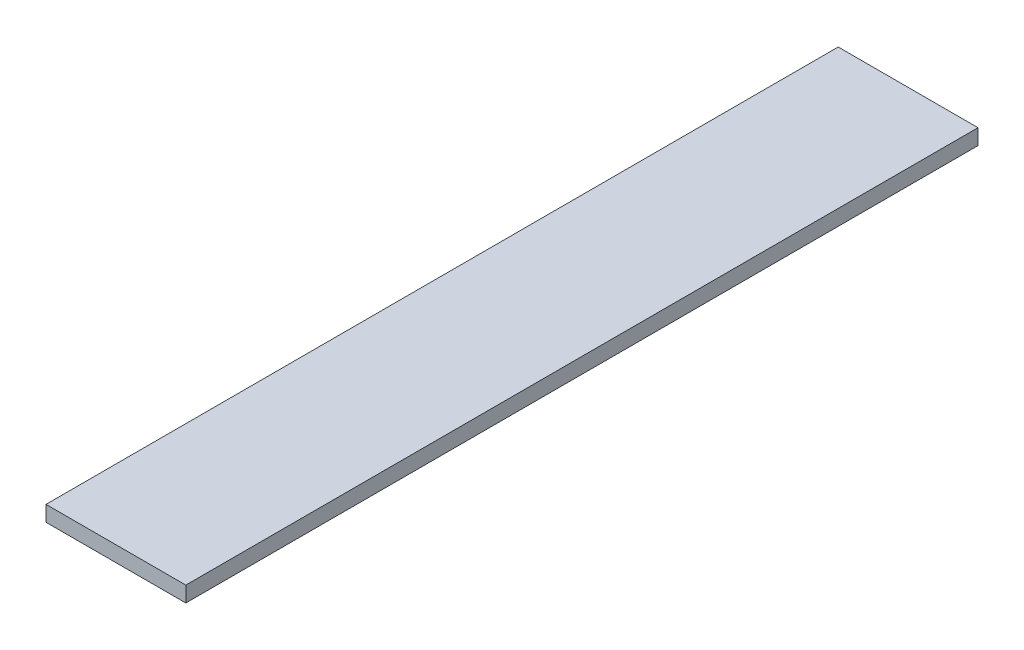
ISO-10303-21;
HEADER;
FILE_DESCRIPTION(('STEP AP214'),'2;1');
FILE_NAME('part.step','',(''),(''),'','','');
FILE_SCHEMA(('AUTOMOTIVE_DESIGN { 1 0 10303 214 1 1 1 1 }'));
ENDSEC;
DATA;
#1=APPLICATION_CONTEXT('core data for automotive mechanical design processes');
#2=APPLICATION_PROTOCOL_DEFINITION('international standard','automotive_design',2000,#1);
#3=PRODUCT_CONTEXT('',#1,'mechanical');
#4=PRODUCT('Part','Part','',(#3));
#5=PRODUCT_RELATED_PRODUCT_CATEGORY('part','',(#4));
#6=PRODUCT_DEFINITION_FORMATION('','',#4);
#7=PRODUCT_DEFINITION_CONTEXT('part definition',#1,'design');
#8=PRODUCT_DEFINITION('design','',#6,#7);
#9=PRODUCT_DEFINITION_SHAPE('','',#8);
#10=(LENGTH_UNIT() NAMED_UNIT(*) SI_UNIT(.MILLI.,.METRE.));
#11=(NAMED_UNIT(*) PLANE_ANGLE_UNIT() SI_UNIT($,.RADIAN.));
#12=(NAMED_UNIT(*) SI_UNIT($,.STERADIAN.) SOLID_ANGLE_UNIT());
#13=UNCERTAINTY_MEASURE_WITH_UNIT(LENGTH_MEASURE(1.E-05),#10,'distance_accuracy_value','');
#14=(GEOMETRIC_REPRESENTATION_CONTEXT(3) GLOBAL_UNCERTAINTY_ASSIGNED_CONTEXT((#13)) GLOBAL_UNIT_ASSIGNED_CONTEXT((#10,
#11,#12)) REPRESENTATION_CONTEXT('',''));
#15=CARTESIAN_POINT('',(0.,0.,0.));
#16=DIRECTION('',(0.,0.,1.));
#17=DIRECTION('',(1.,0.,0.));
#18=AXIS2_PLACEMENT_3D('',#15,#16,#17);
#19=CARTESIAN_POINT('',(57.15,12.7,-323.85));
#20=DIRECTION('',(-1.,0.,0.));
#21=DIRECTION('',(0.,0.,1.));
#22=AXIS2_PLACEMENT_3D('',#19,#20,#21);
#23=PLANE('',#22);
#24=DIRECTION('',(0.,0.,-1.));
#25=VECTOR('',#24,1.);
#26=CARTESIAN_POINT('',(57.15,0.,-323.85));
#27=LINE('',#26,#25);
#28=CARTESIAN_POINT('',(57.15,0.,323.85));
#29=VERTEX_POINT('',#28);
#30=CARTESIAN_POINT('',(57.15,0.,-323.85));
#31=VERTEX_POINT('',#30);
#32=EDGE_CURVE('E107',#29,#31,#27,.T.);
#33=ORIENTED_EDGE('',*,*,#32,.T.);
#34=DIRECTION('',(0.,-1.,0.));
#35=VECTOR('',#34,1.);
#36=CARTESIAN_POINT('',(57.15,12.7,-323.85));
#37=LINE('',#36,#35);
#38=CARTESIAN_POINT('',(57.15,12.7,-323.85));
#39=VERTEX_POINT('',#38);
#40=EDGE_CURVE('E11',#39,#31,#37,.T.);
#41=ORIENTED_EDGE('',*,*,#40,.F.);
#42=DIRECTION('',(0.,0.,-1.));
#43=VECTOR('',#42,1.);
#44=CARTESIAN_POINT('',(57.15,12.7,-323.85));
#45=LINE('',#44,#43);
#46=CARTESIAN_POINT('',(57.15,12.7,323.85));
#47=VERTEX_POINT('',#46);
#48=EDGE_CURVE('E91',#47,#39,#45,.T.);
#49=ORIENTED_EDGE('',*,*,#48,.F.);
#50=DIRECTION('',(0.,-1.,0.));
#51=VECTOR('',#50,1.);
#52=CARTESIAN_POINT('',(57.15,12.7,323.85));
#53=LINE('',#52,#51);
#54=EDGE_CURVE('E103',#47,#29,#53,.T.);
#55=ORIENTED_EDGE('',*,*,#54,.T.);
#56=EDGE_LOOP('',(#33,#41,#49,#55));
#57=FACE_BOUND('',#56,.T.);
#58=ADVANCED_FACE('F39',(#57),#23,.F.);
#59=CARTESIAN_POINT('',(-57.15,12.7,-323.85));
#60=DIRECTION('',(0.,0.,1.));
#61=DIRECTION('',(1.,0.,0.));
#62=AXIS2_PLACEMENT_3D('',#59,#60,#61);
#63=PLANE('',#62);
#64=DIRECTION('',(-1.,0.,0.));
#65=VECTOR('',#64,1.);
#66=CARTESIAN_POINT('',(-57.15,0.,-323.85));
#67=LINE('',#66,#65);
#68=CARTESIAN_POINT('',(-57.15,0.,-323.85));
#69=VERTEX_POINT('',#68);
#70=EDGE_CURVE('E96',#31,#69,#67,.T.);
#71=ORIENTED_EDGE('',*,*,#70,.T.);
#72=DIRECTION('',(0.,-1.,0.));
#73=VECTOR('',#72,1.);
#74=CARTESIAN_POINT('',(-57.15,12.7,-323.85));
#75=LINE('',#74,#73);
#76=CARTESIAN_POINT('',(-57.15,12.7,-323.85));
#77=VERTEX_POINT('',#76);
#78=EDGE_CURVE('E48',#77,#69,#75,.T.);
#79=ORIENTED_EDGE('',*,*,#78,.F.);
#80=DIRECTION('',(-1.,0.,0.));
#81=VECTOR('',#80,1.);
#82=CARTESIAN_POINT('',(-57.15,12.7,-323.85));
#83=LINE('',#82,#81);
#84=EDGE_CURVE('E86',#39,#77,#83,.T.);
#85=ORIENTED_EDGE('',*,*,#84,.F.);
#86=ORIENTED_EDGE('',*,*,#40,.T.);
#87=EDGE_LOOP('',(#71,#79,#85,#86));
#88=FACE_BOUND('',#87,.T.);
#89=ADVANCED_FACE('F95',(#88),#63,.F.);
#90=CARTESIAN_POINT('',(-57.15,12.7,-323.85));
#91=DIRECTION('',(1.,0.,0.));
#92=DIRECTION('',(0.,0.,-1.));
#93=AXIS2_PLACEMENT_3D('',#90,#91,#92);
#94=PLANE('',#93);
#95=DIRECTION('',(0.,0.,1.));
#96=VECTOR('',#95,1.);
#97=CARTESIAN_POINT('',(-57.15,0.,-323.85));
#98=LINE('',#97,#96);
#99=CARTESIAN_POINT('',(-57.1499999999999,0.,323.85));
#100=VERTEX_POINT('',#99);
#101=EDGE_CURVE('E73',#69,#100,#98,.T.);
#102=ORIENTED_EDGE('',*,*,#101,.T.);
#103=DIRECTION('',(0.,-1.,0.));
#104=VECTOR('',#103,1.);
#105=CARTESIAN_POINT('',(-57.1499999999999,12.7,323.85));
#106=LINE('',#105,#104);
#107=CARTESIAN_POINT('',(-57.1499999999999,12.7,323.85));
#108=VERTEX_POINT('',#107);
#109=EDGE_CURVE('E98',#108,#100,#106,.T.);
#110=ORIENTED_EDGE('',*,*,#109,.F.);
#111=DIRECTION('',(0.,0.,1.));
#112=VECTOR('',#111,1.);
#113=CARTESIAN_POINT('',(-57.15,12.7,-323.85));
#114=LINE('',#113,#112);
#115=EDGE_CURVE('E89',#77,#108,#114,.T.);
#116=ORIENTED_EDGE('',*,*,#115,.F.);
#117=ORIENTED_EDGE('',*,*,#78,.T.);
#118=EDGE_LOOP('',(#102,#110,#116,#117));
#119=FACE_BOUND('',#118,.T.);
#120=ADVANCED_FACE('F99',(#119),#94,.F.);
#121=CARTESIAN_POINT('',(-57.1499999999999,12.7,323.85));
#122=DIRECTION('',(0.,0.,-1.));
#123=DIRECTION('',(-1.,0.,0.));
#124=AXIS2_PLACEMENT_3D('',#121,#122,#123);
#125=PLANE('',#124);
#126=DIRECTION('',(1.,0.,0.));
#127=VECTOR('',#126,1.);
#128=CARTESIAN_POINT('',(-57.1499999999999,0.,323.85));
#129=LINE('',#128,#127);
#130=EDGE_CURVE('E79',#100,#29,#129,.T.);
#131=ORIENTED_EDGE('',*,*,#130,.T.);
#132=ORIENTED_EDGE('',*,*,#54,.F.);
#133=DIRECTION('',(1.,0.,0.));
#134=VECTOR('',#133,1.);
#135=CARTESIAN_POINT('',(-57.1499999999999,12.7,323.85));
#136=LINE('',#135,#134);
#137=EDGE_CURVE('E56',#108,#47,#136,.T.);
#138=ORIENTED_EDGE('',*,*,#137,.F.);
#139=ORIENTED_EDGE('',*,*,#109,.T.);
#140=EDGE_LOOP('',(#131,#132,#138,#139));
#141=FACE_BOUND('',#140,.T.);
#142=ADVANCED_FACE('F120',(#141),#125,.F.);
#143=CARTESIAN_POINT('',(0.,12.7,0.));
#144=DIRECTION('',(0.,1.,0.));
#145=DIRECTION('',(0.,0.,1.));
#146=AXIS2_PLACEMENT_3D('',#143,#144,#145);
#147=PLANE('',#146);
#148=ORIENTED_EDGE('',*,*,#48,.T.);
#149=ORIENTED_EDGE('',*,*,#84,.T.);
#150=ORIENTED_EDGE('',*,*,#115,.T.);
#151=ORIENTED_EDGE('',*,*,#137,.T.);
#152=EDGE_LOOP('',(#148,#149,#150,#151));
#153=FACE_BOUND('',#152,.T.);
#154=ADVANCED_FACE('F87',(#153),#147,.T.);
#155=CARTESIAN_POINT('',(0.,0.,0.));
#156=DIRECTION('',(0.,1.,0.));
#157=DIRECTION('',(0.,0.,1.));
#158=AXIS2_PLACEMENT_3D('',#155,#156,#157);
#159=PLANE('',#158);
#160=ORIENTED_EDGE('',*,*,#32,.F.);
#161=ORIENTED_EDGE('',*,*,#130,.F.);
#162=ORIENTED_EDGE('',*,*,#101,.F.);
#163=ORIENTED_EDGE('',*,*,#70,.F.);
#164=EDGE_LOOP('',(#160,#161,#162,#163));
#165=FACE_BOUND('',#164,.T.);
#166=ADVANCED_FACE('F123',(#165),#159,.F.);
#167=CLOSED_SHELL('',(#58,#89,#120,#142,#154,#166));
#168=MANIFOLD_SOLID_BREP('B2',#167);
#169=ADVANCED_BREP_SHAPE_REPRESENTATION('',(#18,#168),#14);
#170=SHAPE_DEFINITION_REPRESENTATION(#9,#169);
ENDSEC;
END-ISO-10303-21;
